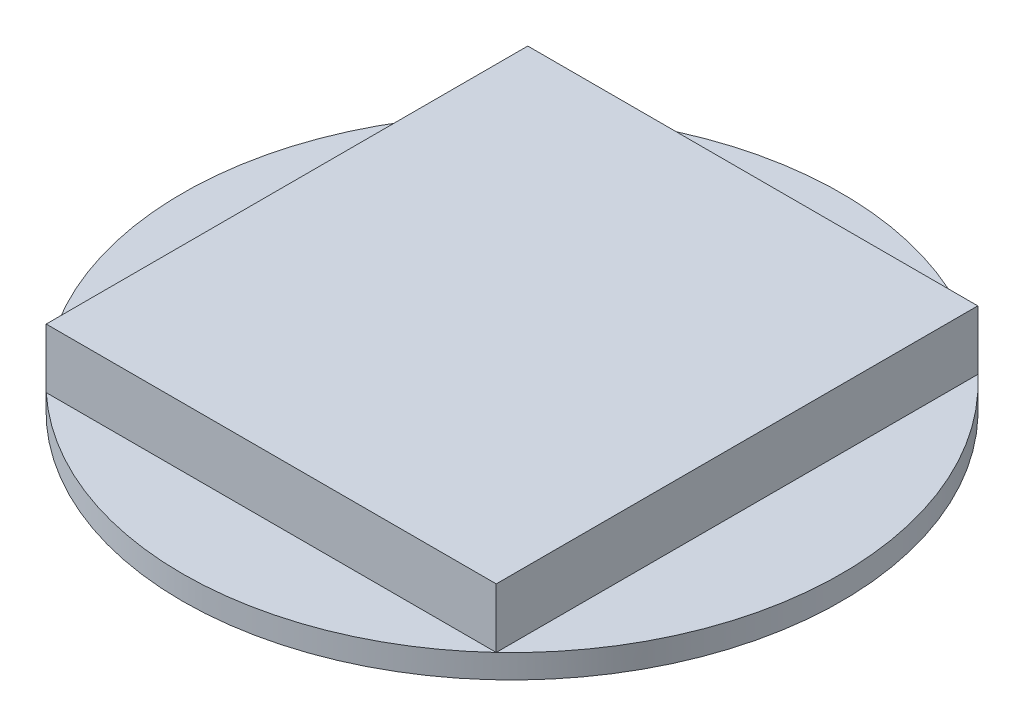
ISO-10303-21;
HEADER;
FILE_DESCRIPTION(('STEP AP214'),'2;1');
FILE_NAME('part.step','',(''),(''),'','','');
FILE_SCHEMA(('AUTOMOTIVE_DESIGN { 1 0 10303 214 1 1 1 1 }'));
ENDSEC;
DATA;
#1=APPLICATION_CONTEXT('core data for automotive mechanical design processes');
#2=APPLICATION_PROTOCOL_DEFINITION('international standard','automotive_design',2000,#1);
#3=PRODUCT_CONTEXT('',#1,'mechanical');
#4=PRODUCT('Part','Part','',(#3));
#5=PRODUCT_RELATED_PRODUCT_CATEGORY('part','',(#4));
#6=PRODUCT_DEFINITION_FORMATION('','',#4);
#7=PRODUCT_DEFINITION_CONTEXT('part definition',#1,'design');
#8=PRODUCT_DEFINITION('design','',#6,#7);
#9=PRODUCT_DEFINITION_SHAPE('','',#8);
#10=(LENGTH_UNIT() NAMED_UNIT(*) SI_UNIT(.MILLI.,.METRE.));
#11=(NAMED_UNIT(*) PLANE_ANGLE_UNIT() SI_UNIT($,.RADIAN.));
#12=(NAMED_UNIT(*) SI_UNIT($,.STERADIAN.) SOLID_ANGLE_UNIT());
#13=UNCERTAINTY_MEASURE_WITH_UNIT(LENGTH_MEASURE(1.E-05),#10,'distance_accuracy_value','');
#14=(GEOMETRIC_REPRESENTATION_CONTEXT(3) GLOBAL_UNCERTAINTY_ASSIGNED_CONTEXT((#13)) GLOBAL_UNIT_ASSIGNED_CONTEXT((#10,
#11,#12)) REPRESENTATION_CONTEXT('',''));
#15=CARTESIAN_POINT('',(0.,0.,0.));
#16=DIRECTION('',(0.,0.,1.));
#17=DIRECTION('',(1.,0.,0.));
#18=AXIS2_PLACEMENT_3D('',#15,#16,#17);
#19=CARTESIAN_POINT('',(0.,10.,0.));
#20=DIRECTION('',(0.,1.,0.));
#21=DIRECTION('',(0.,0.,1.));
#22=AXIS2_PLACEMENT_3D('',#19,#20,#21);
#23=PLANE('',#22);
#24=DIRECTION('',(-1.,0.,0.));
#25=VECTOR('',#24,1.);
#26=CARTESIAN_POINT('',(189.474614813126,10.,-202.74521040315));
#27=LINE('',#26,#25);
#28=CARTESIAN_POINT('',(189.474614813126,10.,-202.74521040315));
#29=VERTEX_POINT('',#28);
#30=CARTESIAN_POINT('',(-189.474614813126,10.,-202.74521040315));
#31=VERTEX_POINT('',#30);
#32=EDGE_CURVE('E59',#29,#31,#27,.T.);
#33=ORIENTED_EDGE('',*,*,#32,.F.);
#34=CARTESIAN_POINT('',(0.,10.,0.));
#35=DIRECTION('',(0.,1.,0.));
#36=DIRECTION('',(0.,0.,1.));
#37=AXIS2_PLACEMENT_3D('',#34,#35,#36);
#38=CIRCLE('',#37,277.5);
#39=EDGE_CURVE('E136',#29,#31,#38,.T.);
#40=ORIENTED_EDGE('',*,*,#39,.T.);
#41=EDGE_LOOP('',(#33,#40));
#42=FACE_BOUND('',#41,.T.);
#43=ADVANCED_FACE('F43',(#42),#23,.T.);
#44=CARTESIAN_POINT('',(-189.474614813126,10.,202.74521040315));
#45=VERTEX_POINT('',#44);
#46=CARTESIAN_POINT('',(189.474614813126,10.,202.74521040315));
#47=VERTEX_POINT('',#46);
#48=EDGE_CURVE('E133',#45,#47,#38,.T.);
#49=ORIENTED_EDGE('',*,*,#48,.T.);
#50=DIRECTION('',(-1.,0.,0.));
#51=VECTOR('',#50,1.);
#52=CARTESIAN_POINT('',(189.474614813126,10.,202.74521040315));
#53=LINE('',#52,#51);
#54=EDGE_CURVE('E123',#47,#45,#53,.T.);
#55=ORIENTED_EDGE('',*,*,#54,.T.);
#56=EDGE_LOOP('',(#49,#55));
#57=FACE_BOUND('',#56,.T.);
#58=ADVANCED_FACE('F155',(#57),#23,.T.);
#59=EDGE_CURVE('E141',#31,#45,#38,.T.);
#60=ORIENTED_EDGE('',*,*,#59,.T.);
#61=DIRECTION('',(0.,0.,-1.));
#62=VECTOR('',#61,1.);
#63=CARTESIAN_POINT('',(-189.474614813126,10.,202.74521040315));
#64=LINE('',#63,#62);
#65=EDGE_CURVE('E98',#45,#31,#64,.T.);
#66=ORIENTED_EDGE('',*,*,#65,.T.);
#67=EDGE_LOOP('',(#60,#66));
#68=FACE_BOUND('',#67,.T.);
#69=ADVANCED_FACE('F150',(#68),#23,.T.);
#70=CARTESIAN_POINT('',(0.,-10.,0.));
#71=DIRECTION('',(0.,1.,0.));
#72=DIRECTION('',(0.,0.,1.));
#73=AXIS2_PLACEMENT_3D('',#70,#71,#72);
#74=CYLINDRICAL_SURFACE('',#73,277.5);
#75=CARTESIAN_POINT('',(0.,-10.,0.));
#76=DIRECTION('',(0.,1.,0.));
#77=DIRECTION('',(0.,0.,1.));
#78=AXIS2_PLACEMENT_3D('',#75,#76,#77);
#79=CIRCLE('',#78,277.5);
#80=CARTESIAN_POINT('',(0.,-10.,277.5));
#81=VERTEX_POINT('',#80);
#82=EDGE_CURVE('E11',#81,#81,#79,.T.);
#83=ORIENTED_EDGE('',*,*,#82,.T.);
#84=EDGE_LOOP('',(#83));
#85=FACE_BOUND('',#84,.T.);
#86=EDGE_CURVE('E52',#47,#29,#38,.T.);
#87=ORIENTED_EDGE('',*,*,#86,.F.);
#88=ORIENTED_EDGE('',*,*,#48,.F.);
#89=ORIENTED_EDGE('',*,*,#59,.F.);
#90=ORIENTED_EDGE('',*,*,#39,.F.);
#91=EDGE_LOOP('',(#87,#88,#89,#90));
#92=FACE_BOUND('',#91,.T.);
#93=ADVANCED_FACE('F45',(#85,#92),#74,.T.);
#94=CARTESIAN_POINT('',(0.,-10.,0.));
#95=DIRECTION('',(0.,1.,0.));
#96=DIRECTION('',(0.,0.,1.));
#97=AXIS2_PLACEMENT_3D('',#94,#95,#96);
#98=PLANE('',#97);
#99=ORIENTED_EDGE('',*,*,#82,.F.);
#100=EDGE_LOOP('',(#99));
#101=FACE_BOUND('',#100,.T.);
#102=ADVANCED_FACE('F164',(#101),#98,.F.);
#103=DIRECTION('',(0.,0.,-1.));
#104=VECTOR('',#103,1.);
#105=CARTESIAN_POINT('',(189.474614813126,10.,202.74521040315));
#106=LINE('',#105,#104);
#107=EDGE_CURVE('E85',#47,#29,#106,.T.);
#108=ORIENTED_EDGE('',*,*,#107,.F.);
#109=ORIENTED_EDGE('',*,*,#86,.T.);
#110=EDGE_LOOP('',(#108,#109));
#111=FACE_BOUND('',#110,.T.);
#112=ADVANCED_FACE('F157',(#111),#23,.T.);
#113=CARTESIAN_POINT('',(189.474614813126,60.,-202.74521040315));
#114=DIRECTION('',(0.,0.,1.));
#115=DIRECTION('',(1.,0.,0.));
#116=AXIS2_PLACEMENT_3D('',#113,#114,#115);
#117=PLANE('',#116);
#118=ORIENTED_EDGE('',*,*,#32,.T.);
#119=DIRECTION('',(0.,-1.,0.));
#120=VECTOR('',#119,1.);
#121=CARTESIAN_POINT('',(-189.474614813126,60.,-202.74521040315));
#122=LINE('',#121,#120);
#123=CARTESIAN_POINT('',(-189.474614813126,60.,-202.74521040315));
#124=VERTEX_POINT('',#123);
#125=EDGE_CURVE('E104',#124,#31,#122,.T.);
#126=ORIENTED_EDGE('',*,*,#125,.F.);
#127=DIRECTION('',(-1.,0.,0.));
#128=VECTOR('',#127,1.);
#129=CARTESIAN_POINT('',(189.474614813126,60.,-202.74521040315));
#130=LINE('',#129,#128);
#131=CARTESIAN_POINT('',(189.474614813126,60.,-202.74521040315));
#132=VERTEX_POINT('',#131);
#133=EDGE_CURVE('E89',#132,#124,#130,.T.);
#134=ORIENTED_EDGE('',*,*,#133,.F.);
#135=DIRECTION('',(0.,-1.,0.));
#136=VECTOR('',#135,1.);
#137=CARTESIAN_POINT('',(189.474614813126,60.,-202.74521040315));
#138=LINE('',#137,#136);
#139=EDGE_CURVE('E115',#132,#29,#138,.T.);
#140=ORIENTED_EDGE('',*,*,#139,.T.);
#141=EDGE_LOOP('',(#118,#126,#134,#140));
#142=FACE_BOUND('',#141,.T.);
#143=ADVANCED_FACE('F163',(#142),#117,.F.);
#144=CARTESIAN_POINT('',(-189.474614813126,60.,202.74521040315));
#145=DIRECTION('',(-1.,0.,0.));
#146=DIRECTION('',(0.,0.,1.));
#147=AXIS2_PLACEMENT_3D('',#144,#145,#146);
#148=PLANE('',#147);
#149=ORIENTED_EDGE('',*,*,#65,.F.);
#150=DIRECTION('',(0.,-1.,0.));
#151=VECTOR('',#150,1.);
#152=CARTESIAN_POINT('',(-189.474614813126,60.,202.74521040315));
#153=LINE('',#152,#151);
#154=CARTESIAN_POINT('',(-189.474614813126,60.,202.74521040315));
#155=VERTEX_POINT('',#154);
#156=EDGE_CURVE('E94',#155,#45,#153,.T.);
#157=ORIENTED_EDGE('',*,*,#156,.F.);
#158=DIRECTION('',(0.,0.,-1.));
#159=VECTOR('',#158,1.);
#160=CARTESIAN_POINT('',(-189.474614813126,60.,202.74521040315));
#161=LINE('',#160,#159);
#162=EDGE_CURVE('E96',#155,#124,#161,.T.);
#163=ORIENTED_EDGE('',*,*,#162,.T.);
#164=ORIENTED_EDGE('',*,*,#125,.T.);
#165=EDGE_LOOP('',(#149,#157,#163,#164));
#166=FACE_BOUND('',#165,.T.);
#167=ADVANCED_FACE('F95',(#166),#148,.T.);
#168=CARTESIAN_POINT('',(189.474614813126,60.,202.74521040315));
#169=DIRECTION('',(0.,0.,1.));
#170=DIRECTION('',(1.,0.,0.));
#171=AXIS2_PLACEMENT_3D('',#168,#169,#170);
#172=PLANE('',#171);
#173=ORIENTED_EDGE('',*,*,#54,.F.);
#174=DIRECTION('',(0.,-1.,0.));
#175=VECTOR('',#174,1.);
#176=CARTESIAN_POINT('',(189.474614813126,60.,202.74521040315));
#177=LINE('',#176,#175);
#178=CARTESIAN_POINT('',(189.474614813126,60.,202.74521040315));
#179=VERTEX_POINT('',#178);
#180=EDGE_CURVE('E105',#179,#47,#177,.T.);
#181=ORIENTED_EDGE('',*,*,#180,.F.);
#182=DIRECTION('',(-1.,0.,0.));
#183=VECTOR('',#182,1.);
#184=CARTESIAN_POINT('',(189.474614813126,60.,202.74521040315));
#185=LINE('',#184,#183);
#186=EDGE_CURVE('E108',#179,#155,#185,.T.);
#187=ORIENTED_EDGE('',*,*,#186,.T.);
#188=ORIENTED_EDGE('',*,*,#156,.T.);
#189=EDGE_LOOP('',(#173,#181,#187,#188));
#190=FACE_BOUND('',#189,.T.);
#191=ADVANCED_FACE('F111',(#190),#172,.T.);
#192=CARTESIAN_POINT('',(189.474614813126,60.,202.74521040315));
#193=DIRECTION('',(-1.,0.,0.));
#194=DIRECTION('',(0.,0.,1.));
#195=AXIS2_PLACEMENT_3D('',#192,#193,#194);
#196=PLANE('',#195);
#197=ORIENTED_EDGE('',*,*,#107,.T.);
#198=ORIENTED_EDGE('',*,*,#139,.F.);
#199=DIRECTION('',(0.,0.,-1.));
#200=VECTOR('',#199,1.);
#201=CARTESIAN_POINT('',(189.474614813126,60.,202.74521040315));
#202=LINE('',#201,#200);
#203=EDGE_CURVE('E68',#179,#132,#202,.T.);
#204=ORIENTED_EDGE('',*,*,#203,.F.);
#205=ORIENTED_EDGE('',*,*,#180,.T.);
#206=EDGE_LOOP('',(#197,#198,#204,#205));
#207=FACE_BOUND('',#206,.T.);
#208=ADVANCED_FACE('F235',(#207),#196,.F.);
#209=CARTESIAN_POINT('',(0.,60.,0.));
#210=DIRECTION('',(0.,-1.,0.));
#211=DIRECTION('',(0.,0.,-1.));
#212=AXIS2_PLACEMENT_3D('',#209,#210,#211);
#213=PLANE('',#212);
#214=ORIENTED_EDGE('',*,*,#133,.T.);
#215=ORIENTED_EDGE('',*,*,#162,.F.);
#216=ORIENTED_EDGE('',*,*,#186,.F.);
#217=ORIENTED_EDGE('',*,*,#203,.T.);
#218=EDGE_LOOP('',(#214,#215,#216,#217));
#219=FACE_BOUND('',#218,.T.);
#220=ADVANCED_FACE('F107',(#219),#213,.F.);
#221=CLOSED_SHELL('',(#43,#58,#69,#93,#102,#112,#143,#167,#191,#208,#220));
#222=MANIFOLD_SOLID_BREP('B2',#221);
#223=ADVANCED_BREP_SHAPE_REPRESENTATION('',(#18,#222),#14);
#224=SHAPE_DEFINITION_REPRESENTATION(#9,#223);
ENDSEC;
END-ISO-10303-21;
